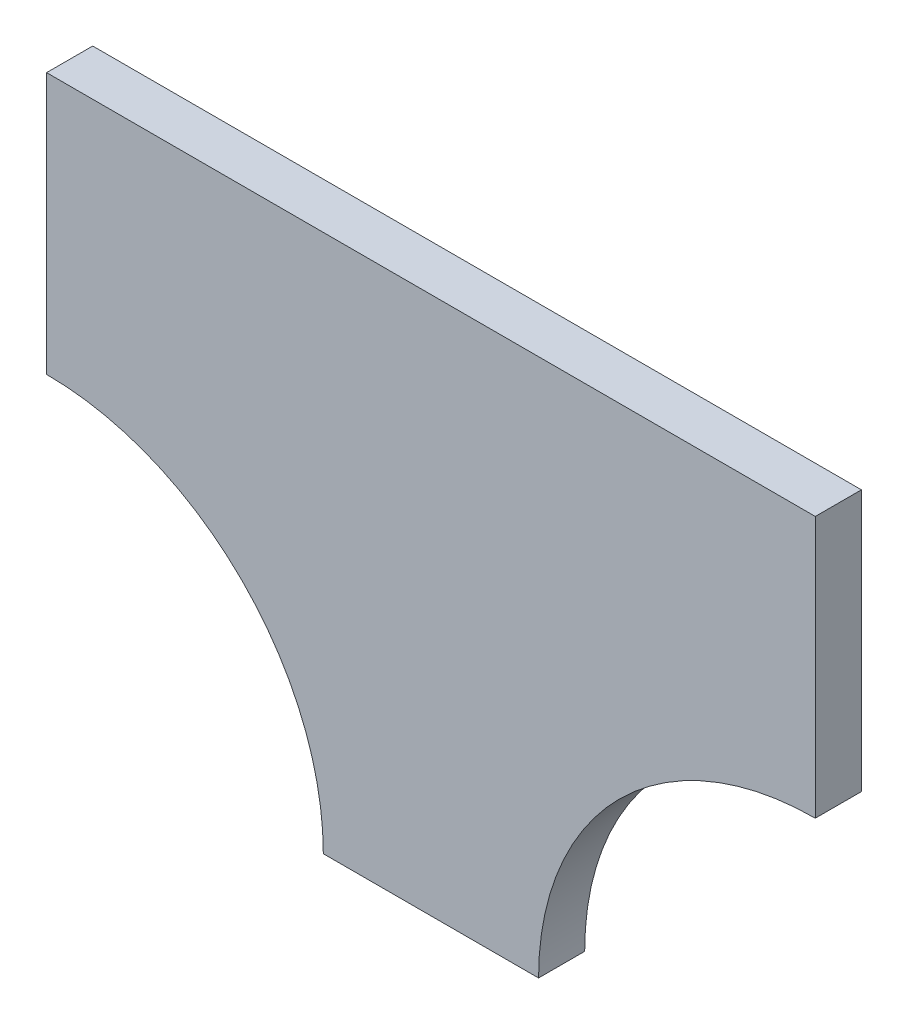
ISO-10303-21;
HEADER;
FILE_DESCRIPTION(('STEP AP214'),'2;1');
FILE_NAME('part.step','',(''),(''),'','','');
FILE_SCHEMA(('AUTOMOTIVE_DESIGN { 1 0 10303 214 1 1 1 1 }'));
ENDSEC;
DATA;
#1=APPLICATION_CONTEXT('core data for automotive mechanical design processes');
#2=APPLICATION_PROTOCOL_DEFINITION('international standard','automotive_design',2000,#1);
#3=PRODUCT_CONTEXT('',#1,'mechanical');
#4=PRODUCT('Part','Part','',(#3));
#5=PRODUCT_RELATED_PRODUCT_CATEGORY('part','',(#4));
#6=PRODUCT_DEFINITION_FORMATION('','',#4);
#7=PRODUCT_DEFINITION_CONTEXT('part definition',#1,'design');
#8=PRODUCT_DEFINITION('design','',#6,#7);
#9=PRODUCT_DEFINITION_SHAPE('','',#8);
#10=(LENGTH_UNIT() NAMED_UNIT(*) SI_UNIT(.MILLI.,.METRE.));
#11=(NAMED_UNIT(*) PLANE_ANGLE_UNIT() SI_UNIT($,.RADIAN.));
#12=(NAMED_UNIT(*) SI_UNIT($,.STERADIAN.) SOLID_ANGLE_UNIT());
#13=UNCERTAINTY_MEASURE_WITH_UNIT(LENGTH_MEASURE(1.E-05),#10,'distance_accuracy_value','');
#14=(GEOMETRIC_REPRESENTATION_CONTEXT(3) GLOBAL_UNCERTAINTY_ASSIGNED_CONTEXT((#13)) GLOBAL_UNIT_ASSIGNED_CONTEXT((#10,
#11,#12)) REPRESENTATION_CONTEXT('',''));
#15=CARTESIAN_POINT('',(0.,0.,0.));
#16=DIRECTION('',(0.,0.,1.));
#17=DIRECTION('',(1.,0.,0.));
#18=AXIS2_PLACEMENT_3D('',#15,#16,#17);
#19=CARTESIAN_POINT('',(1000.,-700.,120.));
#20=DIRECTION('',(0.,0.,-1.));
#21=DIRECTION('',(-1.,0.,0.));
#22=AXIS2_PLACEMENT_3D('',#19,#20,#21);
#23=CYLINDRICAL_SURFACE('',#22,720.);
#24=CARTESIAN_POINT('',(1000.,-700.,0.));
#25=DIRECTION('',(0.,0.,1.));
#26=DIRECTION('',(1.,0.,0.));
#27=AXIS2_PLACEMENT_3D('',#24,#25,#26);
#28=CIRCLE('',#27,720.);
#29=CARTESIAN_POINT('',(1000.,19.9999999999999,0.));
#30=VERTEX_POINT('',#29);
#31=CARTESIAN_POINT('',(280.,-700.,0.));
#32=VERTEX_POINT('',#31);
#33=EDGE_CURVE('E121',#30,#32,#28,.T.);
#34=ORIENTED_EDGE('',*,*,#33,.F.);
#35=DIRECTION('',(0.,0.,-1.));
#36=VECTOR('',#35,1.);
#37=CARTESIAN_POINT('',(1000.,19.9999999999999,120.));
#38=LINE('',#37,#36);
#39=CARTESIAN_POINT('',(1000.,19.9999999999999,120.));
#40=VERTEX_POINT('',#39);
#41=EDGE_CURVE('E11',#40,#30,#38,.T.);
#42=ORIENTED_EDGE('',*,*,#41,.F.);
#43=CARTESIAN_POINT('',(1000.,-700.,120.));
#44=DIRECTION('',(0.,0.,1.));
#45=DIRECTION('',(1.,0.,0.));
#46=AXIS2_PLACEMENT_3D('',#43,#44,#45);
#47=CIRCLE('',#46,720.);
#48=CARTESIAN_POINT('',(280.,-700.,120.));
#49=VERTEX_POINT('',#48);
#50=EDGE_CURVE('E135',#40,#49,#47,.T.);
#51=ORIENTED_EDGE('',*,*,#50,.T.);
#52=DIRECTION('',(0.,0.,-1.));
#53=VECTOR('',#52,1.);
#54=CARTESIAN_POINT('',(280.,-700.,120.));
#55=LINE('',#54,#53);
#56=EDGE_CURVE('E84',#49,#32,#55,.T.);
#57=ORIENTED_EDGE('',*,*,#56,.T.);
#58=EDGE_LOOP('',(#34,#42,#51,#57));
#59=FACE_BOUND('',#58,.T.);
#60=ADVANCED_FACE('F40',(#59),#23,.F.);
#61=CARTESIAN_POINT('',(1000.,0.,120.));
#62=DIRECTION('',(-1.,0.,0.));
#63=DIRECTION('',(0.,0.,1.));
#64=AXIS2_PLACEMENT_3D('',#61,#62,#63);
#65=PLANE('',#64);
#66=DIRECTION('',(0.,1.,0.));
#67=VECTOR('',#66,1.);
#68=CARTESIAN_POINT('',(1000.,0.,0.));
#69=LINE('',#68,#67);
#70=CARTESIAN_POINT('',(1000.,700.,0.));
#71=VERTEX_POINT('',#70);
#72=EDGE_CURVE('E124',#30,#71,#69,.T.);
#73=ORIENTED_EDGE('',*,*,#72,.T.);
#74=DIRECTION('',(0.,0.,-1.));
#75=VECTOR('',#74,1.);
#76=CARTESIAN_POINT('',(1000.,700.,120.));
#77=LINE('',#76,#75);
#78=CARTESIAN_POINT('',(1000.,700.,120.));
#79=VERTEX_POINT('',#78);
#80=EDGE_CURVE('E48',#79,#71,#77,.T.);
#81=ORIENTED_EDGE('',*,*,#80,.F.);
#82=DIRECTION('',(0.,1.,0.));
#83=VECTOR('',#82,1.);
#84=CARTESIAN_POINT('',(1000.,0.,120.));
#85=LINE('',#84,#83);
#86=EDGE_CURVE('E148',#40,#79,#85,.T.);
#87=ORIENTED_EDGE('',*,*,#86,.F.);
#88=ORIENTED_EDGE('',*,*,#41,.T.);
#89=EDGE_LOOP('',(#73,#81,#87,#88));
#90=FACE_BOUND('',#89,.T.);
#91=ADVANCED_FACE('F144',(#90),#65,.F.);
#92=CARTESIAN_POINT('',(0.,700.,120.));
#93=DIRECTION('',(0.,1.,0.));
#94=DIRECTION('',(-1.,0.,0.));
#95=AXIS2_PLACEMENT_3D('',#92,#93,#94);
#96=PLANE('',#95);
#97=DIRECTION('',(1.,0.,0.));
#98=VECTOR('',#97,1.);
#99=CARTESIAN_POINT('',(0.,700.,0.));
#100=LINE('',#99,#98);
#101=CARTESIAN_POINT('',(-1000.,700.,0.));
#102=VERTEX_POINT('',#101);
#103=EDGE_CURVE('E127',#102,#71,#100,.T.);
#104=ORIENTED_EDGE('',*,*,#103,.F.);
#105=DIRECTION('',(0.,0.,-1.));
#106=VECTOR('',#105,1.);
#107=CARTESIAN_POINT('',(-1000.,700.,120.));
#108=LINE('',#107,#106);
#109=CARTESIAN_POINT('',(-1000.,700.,120.));
#110=VERTEX_POINT('',#109);
#111=EDGE_CURVE('E108',#110,#102,#108,.T.);
#112=ORIENTED_EDGE('',*,*,#111,.F.);
#113=DIRECTION('',(1.,0.,0.));
#114=VECTOR('',#113,1.);
#115=CARTESIAN_POINT('',(0.,700.,120.));
#116=LINE('',#115,#114);
#117=EDGE_CURVE('E114',#110,#79,#116,.T.);
#118=ORIENTED_EDGE('',*,*,#117,.T.);
#119=ORIENTED_EDGE('',*,*,#80,.T.);
#120=EDGE_LOOP('',(#104,#112,#118,#119));
#121=FACE_BOUND('',#120,.T.);
#122=ADVANCED_FACE('F141',(#121),#96,.T.);
#123=CARTESIAN_POINT('',(-1000.,0.,120.));
#124=DIRECTION('',(-1.,0.,0.));
#125=DIRECTION('',(0.,0.,1.));
#126=AXIS2_PLACEMENT_3D('',#123,#124,#125);
#127=PLANE('',#126);
#128=DIRECTION('',(0.,1.,0.));
#129=VECTOR('',#128,1.);
#130=CARTESIAN_POINT('',(-1000.,0.,0.));
#131=LINE('',#130,#129);
#132=CARTESIAN_POINT('',(-1000.,20.,0.));
#133=VERTEX_POINT('',#132);
#134=EDGE_CURVE('E103',#133,#102,#131,.T.);
#135=ORIENTED_EDGE('',*,*,#134,.F.);
#136=DIRECTION('',(0.,0.,-1.));
#137=VECTOR('',#136,1.);
#138=CARTESIAN_POINT('',(-1000.,20.,120.));
#139=LINE('',#138,#137);
#140=CARTESIAN_POINT('',(-1000.,20.,120.));
#141=VERTEX_POINT('',#140);
#142=EDGE_CURVE('E98',#141,#133,#139,.T.);
#143=ORIENTED_EDGE('',*,*,#142,.F.);
#144=DIRECTION('',(0.,1.,0.));
#145=VECTOR('',#144,1.);
#146=CARTESIAN_POINT('',(-1000.,0.,120.));
#147=LINE('',#146,#145);
#148=EDGE_CURVE('E101',#141,#110,#147,.T.);
#149=ORIENTED_EDGE('',*,*,#148,.T.);
#150=ORIENTED_EDGE('',*,*,#111,.T.);
#151=EDGE_LOOP('',(#135,#143,#149,#150));
#152=FACE_BOUND('',#151,.T.);
#153=ADVANCED_FACE('F100',(#152),#127,.T.);
#154=CARTESIAN_POINT('',(-1000.,-700.,120.));
#155=DIRECTION('',(0.,0.,-1.));
#156=DIRECTION('',(-1.,0.,0.));
#157=AXIS2_PLACEMENT_3D('',#154,#155,#156);
#158=CYLINDRICAL_SURFACE('',#157,720.);
#159=CARTESIAN_POINT('',(-1000.,-700.,0.));
#160=DIRECTION('',(0.,0.,1.));
#161=DIRECTION('',(1.,0.,0.));
#162=AXIS2_PLACEMENT_3D('',#159,#160,#161);
#163=CIRCLE('',#162,720.);
#164=CARTESIAN_POINT('',(-280.,-700.,0.));
#165=VERTEX_POINT('',#164);
#166=EDGE_CURVE('E131',#165,#133,#163,.T.);
#167=ORIENTED_EDGE('',*,*,#166,.F.);
#168=DIRECTION('',(0.,0.,-1.));
#169=VECTOR('',#168,1.);
#170=CARTESIAN_POINT('',(-280.,-700.,120.));
#171=LINE('',#170,#169);
#172=CARTESIAN_POINT('',(-280.,-700.,120.));
#173=VERTEX_POINT('',#172);
#174=EDGE_CURVE('E77',#173,#165,#171,.T.);
#175=ORIENTED_EDGE('',*,*,#174,.F.);
#176=CARTESIAN_POINT('',(-1000.,-700.,120.));
#177=DIRECTION('',(0.,0.,1.));
#178=DIRECTION('',(1.,0.,0.));
#179=AXIS2_PLACEMENT_3D('',#176,#177,#178);
#180=CIRCLE('',#179,720.);
#181=EDGE_CURVE('E112',#173,#141,#180,.T.);
#182=ORIENTED_EDGE('',*,*,#181,.T.);
#183=ORIENTED_EDGE('',*,*,#142,.T.);
#184=EDGE_LOOP('',(#167,#175,#182,#183));
#185=FACE_BOUND('',#184,.T.);
#186=ADVANCED_FACE('F116',(#185),#158,.F.);
#187=CARTESIAN_POINT('',(0.,-700.,120.));
#188=DIRECTION('',(0.,1.,0.));
#189=DIRECTION('',(-1.,0.,0.));
#190=AXIS2_PLACEMENT_3D('',#187,#188,#189);
#191=PLANE('',#190);
#192=DIRECTION('',(1.,0.,0.));
#193=VECTOR('',#192,1.);
#194=CARTESIAN_POINT('',(0.,-700.,0.));
#195=LINE('',#194,#193);
#196=EDGE_CURVE('E133',#165,#32,#195,.T.);
#197=ORIENTED_EDGE('',*,*,#196,.T.);
#198=ORIENTED_EDGE('',*,*,#56,.F.);
#199=DIRECTION('',(1.,0.,0.));
#200=VECTOR('',#199,1.);
#201=CARTESIAN_POINT('',(0.,-700.,120.));
#202=LINE('',#201,#200);
#203=EDGE_CURVE('E56',#173,#49,#202,.T.);
#204=ORIENTED_EDGE('',*,*,#203,.F.);
#205=ORIENTED_EDGE('',*,*,#174,.T.);
#206=EDGE_LOOP('',(#197,#198,#204,#205));
#207=FACE_BOUND('',#206,.T.);
#208=ADVANCED_FACE('F147',(#207),#191,.F.);
#209=CARTESIAN_POINT('',(0.,0.,120.));
#210=DIRECTION('',(0.,0.,1.));
#211=DIRECTION('',(1.,0.,0.));
#212=AXIS2_PLACEMENT_3D('',#209,#210,#211);
#213=PLANE('',#212);
#214=ORIENTED_EDGE('',*,*,#50,.F.);
#215=ORIENTED_EDGE('',*,*,#86,.T.);
#216=ORIENTED_EDGE('',*,*,#117,.F.);
#217=ORIENTED_EDGE('',*,*,#148,.F.);
#218=ORIENTED_EDGE('',*,*,#181,.F.);
#219=ORIENTED_EDGE('',*,*,#203,.T.);
#220=EDGE_LOOP('',(#214,#215,#216,#217,#218,#219));
#221=FACE_BOUND('',#220,.T.);
#222=ADVANCED_FACE('F111',(#221),#213,.T.);
#223=CARTESIAN_POINT('',(0.,0.,0.));
#224=DIRECTION('',(0.,0.,1.));
#225=DIRECTION('',(1.,0.,0.));
#226=AXIS2_PLACEMENT_3D('',#223,#224,#225);
#227=PLANE('',#226);
#228=ORIENTED_EDGE('',*,*,#33,.T.);
#229=ORIENTED_EDGE('',*,*,#196,.F.);
#230=ORIENTED_EDGE('',*,*,#166,.T.);
#231=ORIENTED_EDGE('',*,*,#134,.T.);
#232=ORIENTED_EDGE('',*,*,#103,.T.);
#233=ORIENTED_EDGE('',*,*,#72,.F.);
#234=EDGE_LOOP('',(#228,#229,#230,#231,#232,#233));
#235=FACE_BOUND('',#234,.T.);
#236=ADVANCED_FACE('F146',(#235),#227,.F.);
#237=CLOSED_SHELL('',(#60,#91,#122,#153,#186,#208,#222,#236));
#238=MANIFOLD_SOLID_BREP('B2',#237);
#239=ADVANCED_BREP_SHAPE_REPRESENTATION('',(#18,#238),#14);
#240=SHAPE_DEFINITION_REPRESENTATION(#9,#239);
ENDSEC;
END-ISO-10303-21;
